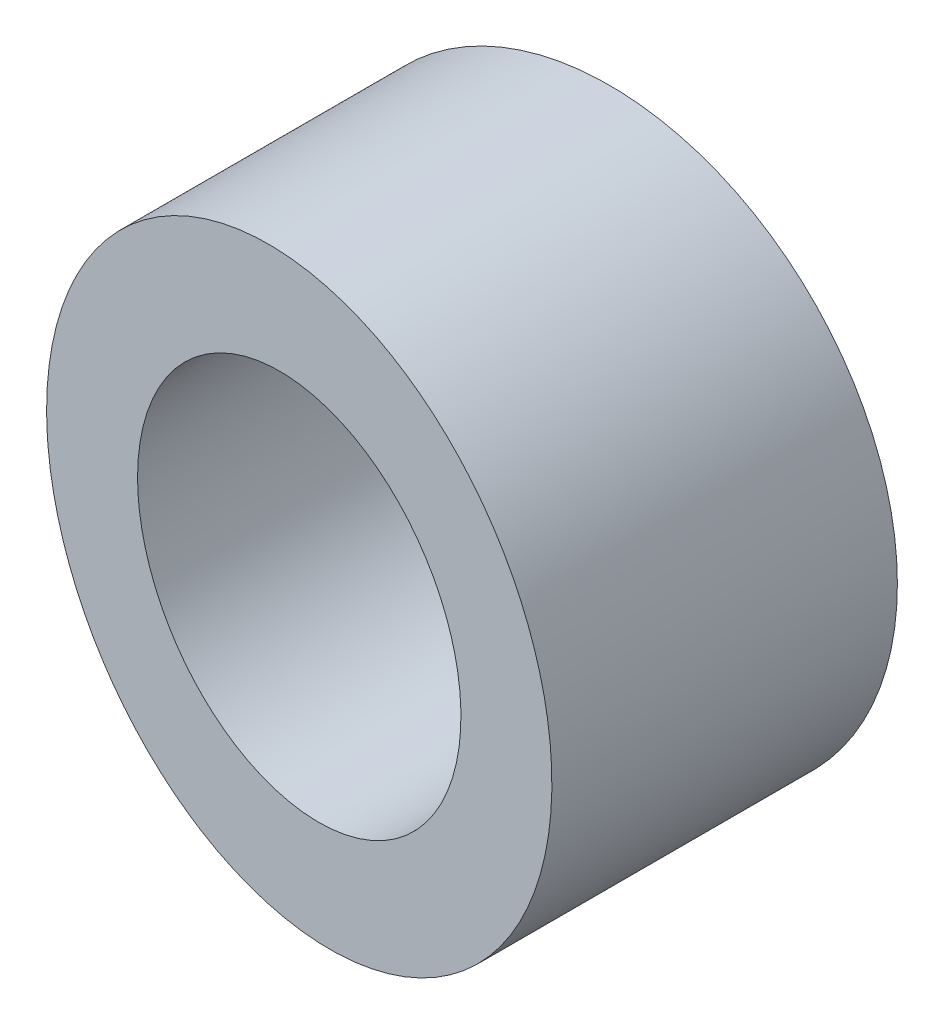
ISO-10303-21;
HEADER;
FILE_DESCRIPTION(('STEP AP214'),'2;1');
FILE_NAME('part.step','',(''),(''),'','','');
FILE_SCHEMA(('AUTOMOTIVE_DESIGN { 1 0 10303 214 1 1 1 1 }'));
ENDSEC;
DATA;
#1=APPLICATION_CONTEXT('core data for automotive mechanical design processes');
#2=APPLICATION_PROTOCOL_DEFINITION('international standard','automotive_design',2000,#1);
#3=PRODUCT_CONTEXT('',#1,'mechanical');
#4=PRODUCT('Part','Part','',(#3));
#5=PRODUCT_RELATED_PRODUCT_CATEGORY('part','',(#4));
#6=PRODUCT_DEFINITION_FORMATION('','',#4);
#7=PRODUCT_DEFINITION_CONTEXT('part definition',#1,'design');
#8=PRODUCT_DEFINITION('design','',#6,#7);
#9=PRODUCT_DEFINITION_SHAPE('','',#8);
#10=(LENGTH_UNIT() NAMED_UNIT(*) SI_UNIT(.MILLI.,.METRE.));
#11=(NAMED_UNIT(*) PLANE_ANGLE_UNIT() SI_UNIT($,.RADIAN.));
#12=(NAMED_UNIT(*) SI_UNIT($,.STERADIAN.) SOLID_ANGLE_UNIT());
#13=UNCERTAINTY_MEASURE_WITH_UNIT(LENGTH_MEASURE(1.E-05),#10,'distance_accuracy_value','');
#14=(GEOMETRIC_REPRESENTATION_CONTEXT(3) GLOBAL_UNCERTAINTY_ASSIGNED_CONTEXT((#13)) GLOBAL_UNIT_ASSIGNED_CONTEXT((#10,
#11,#12)) REPRESENTATION_CONTEXT('',''));
#15=CARTESIAN_POINT('',(0.,0.,0.));
#16=DIRECTION('',(0.,0.,1.));
#17=DIRECTION('',(1.,0.,0.));
#18=AXIS2_PLACEMENT_3D('',#15,#16,#17);
#19=CARTESIAN_POINT('',(0.,0.,0.));
#20=DIRECTION('',(0.,0.,1.));
#21=DIRECTION('',(1.,0.,0.));
#22=AXIS2_PLACEMENT_3D('',#19,#20,#21);
#23=PLANE('',#22);
#24=CARTESIAN_POINT('',(0.,0.,0.));
#25=DIRECTION('',(0.,0.,1.));
#26=DIRECTION('',(1.,0.,0.));
#27=AXIS2_PLACEMENT_3D('',#24,#25,#26);
#28=CIRCLE('',#27,12.5);
#29=CARTESIAN_POINT('',(12.5,0.,0.));
#30=VERTEX_POINT('',#29);
#31=EDGE_CURVE('E10',#30,#30,#28,.T.);
#32=ORIENTED_EDGE('',*,*,#31,.F.);
#33=EDGE_LOOP('',(#32));
#34=FACE_BOUND('',#33,.T.);
#35=CARTESIAN_POINT('',(0.,0.,0.));
#36=DIRECTION('',(0.,0.,1.));
#37=DIRECTION('',(1.,0.,0.));
#38=AXIS2_PLACEMENT_3D('',#35,#36,#37);
#39=CIRCLE('',#38,8.);
#40=CARTESIAN_POINT('',(8.,0.,0.));
#41=VERTEX_POINT('',#40);
#42=EDGE_CURVE('E39',#41,#41,#39,.T.);
#43=ORIENTED_EDGE('',*,*,#42,.T.);
#44=EDGE_LOOP('',(#43));
#45=FACE_BOUND('',#44,.T.);
#46=ADVANCED_FACE('F31',(#34,#45),#23,.F.);
#47=CARTESIAN_POINT('',(0.,0.,15.));
#48=DIRECTION('',(0.,0.,-1.));
#49=DIRECTION('',(-1.,0.,0.));
#50=AXIS2_PLACEMENT_3D('',#47,#48,#49);
#51=CYLINDRICAL_SURFACE('',#50,12.5);
#52=CARTESIAN_POINT('',(0.,0.,13.46875));
#53=DIRECTION('',(0.121591084055229,0.,-0.992580278001872));
#54=DIRECTION('',(-0.992580278001872,0.,-0.121591084055229));
#55=AXIS2_PLACEMENT_3D('',#52,#53,#54);
#56=ELLIPSE('',#55,12.593439822483,12.5);
#57=CARTESIAN_POINT('',(-12.5,0.,11.9375));
#58=VERTEX_POINT('',#57);
#59=EDGE_CURVE('E43',#58,#58,#56,.T.);
#60=ORIENTED_EDGE('',*,*,#59,.T.);
#61=EDGE_LOOP('',(#60));
#62=FACE_BOUND('',#61,.T.);
#63=ORIENTED_EDGE('',*,*,#31,.T.);
#64=EDGE_LOOP('',(#63));
#65=FACE_BOUND('',#64,.T.);
#66=ADVANCED_FACE('F33',(#62,#65),#51,.T.);
#67=CARTESIAN_POINT('',(0.,0.,15.));
#68=DIRECTION('',(0.,0.,-1.));
#69=DIRECTION('',(-1.,0.,0.));
#70=AXIS2_PLACEMENT_3D('',#67,#68,#69);
#71=CYLINDRICAL_SURFACE('',#70,8.);
#72=CARTESIAN_POINT('',(0.,0.,13.46875));
#73=DIRECTION('',(0.121591084055229,0.,-0.992580278001872));
#74=DIRECTION('',(-0.992580278001872,0.,-0.121591084055229));
#75=AXIS2_PLACEMENT_3D('',#72,#73,#74);
#76=ELLIPSE('',#75,8.05980148638911,8.);
#77=CARTESIAN_POINT('',(-8.,0.,12.48875));
#78=VERTEX_POINT('',#77);
#79=EDGE_CURVE('E35',#78,#78,#76,.T.);
#80=ORIENTED_EDGE('',*,*,#79,.F.);
#81=EDGE_LOOP('',(#80));
#82=FACE_BOUND('',#81,.T.);
#83=ORIENTED_EDGE('',*,*,#42,.F.);
#84=EDGE_LOOP('',(#83));
#85=FACE_BOUND('',#84,.T.);
#86=ADVANCED_FACE('F55',(#82,#85),#71,.F.);
#87=CARTESIAN_POINT('',(-135.487207947256,-103.,-3.1284329735388));
#88=DIRECTION('',(0.121591084055229,0.,-0.992580278001872));
#89=DIRECTION('',(-0.992580278001872,0.,-0.121591084055229));
#90=AXIS2_PLACEMENT_3D('',#87,#88,#89);
#91=PLANE('',#90);
#92=ORIENTED_EDGE('',*,*,#79,.T.);
#93=EDGE_LOOP('',(#92));
#94=FACE_BOUND('',#93,.T.);
#95=ORIENTED_EDGE('',*,*,#59,.F.);
#96=EDGE_LOOP('',(#95));
#97=FACE_BOUND('',#96,.T.);
#98=ADVANCED_FACE('F52',(#94,#97),#91,.F.);
#99=CLOSED_SHELL('',(#46,#66,#86,#98));
#100=MANIFOLD_SOLID_BREP('B2',#99);
#101=ADVANCED_BREP_SHAPE_REPRESENTATION('',(#18,#100),#14);
#102=SHAPE_DEFINITION_REPRESENTATION(#9,#101);
ENDSEC;
END-ISO-10303-21;
